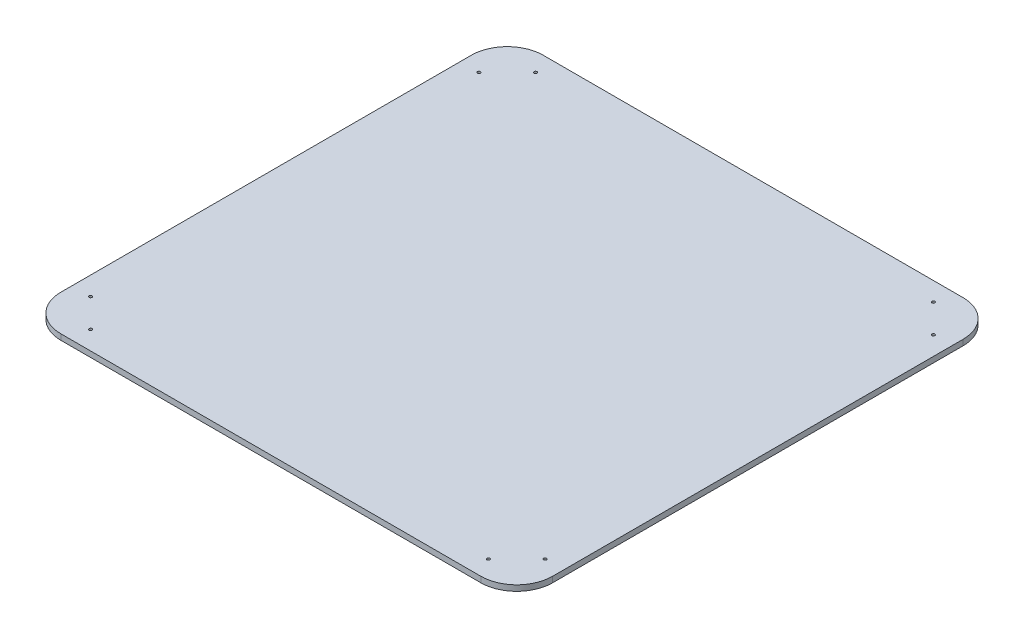
ISO-10303-21;
HEADER;
FILE_DESCRIPTION(('STEP AP214'),'2;1');
FILE_NAME('part.step','',(''),(''),'','','');
FILE_SCHEMA(('AUTOMOTIVE_DESIGN { 1 0 10303 214 1 1 1 1 }'));
ENDSEC;
DATA;
#1=APPLICATION_CONTEXT('core data for automotive mechanical design processes');
#2=APPLICATION_PROTOCOL_DEFINITION('international standard','automotive_design',2000,#1);
#3=PRODUCT_CONTEXT('',#1,'mechanical');
#4=PRODUCT('Part','Part','',(#3));
#5=PRODUCT_RELATED_PRODUCT_CATEGORY('part','',(#4));
#6=PRODUCT_DEFINITION_FORMATION('','',#4);
#7=PRODUCT_DEFINITION_CONTEXT('part definition',#1,'design');
#8=PRODUCT_DEFINITION('design','',#6,#7);
#9=PRODUCT_DEFINITION_SHAPE('','',#8);
#10=(LENGTH_UNIT() NAMED_UNIT(*) SI_UNIT(.MILLI.,.METRE.));
#11=(NAMED_UNIT(*) PLANE_ANGLE_UNIT() SI_UNIT($,.RADIAN.));
#12=(NAMED_UNIT(*) SI_UNIT($,.STERADIAN.) SOLID_ANGLE_UNIT());
#13=UNCERTAINTY_MEASURE_WITH_UNIT(LENGTH_MEASURE(1.E-05),#10,'distance_accuracy_value','');
#14=(GEOMETRIC_REPRESENTATION_CONTEXT(3) GLOBAL_UNCERTAINTY_ASSIGNED_CONTEXT((#13)) GLOBAL_UNIT_ASSIGNED_CONTEXT((#10,
#11,#12)) REPRESENTATION_CONTEXT('',''));
#15=CARTESIAN_POINT('',(0.,0.,0.));
#16=DIRECTION('',(0.,0.,1.));
#17=DIRECTION('',(1.,0.,0.));
#18=AXIS2_PLACEMENT_3D('',#15,#16,#17);
#19=CARTESIAN_POINT('',(0.,6.,0.));
#20=DIRECTION('',(1.,0.,0.));
#21=DIRECTION('',(0.,0.,-1.));
#22=AXIS2_PLACEMENT_3D('',#19,#20,#21);
#23=PLANE('',#22);
#24=DIRECTION('',(0.,0.,1.));
#25=VECTOR('',#24,1.);
#26=CARTESIAN_POINT('',(0.,0.,0.));
#27=LINE('',#26,#25);
#28=CARTESIAN_POINT('',(0.,0.,-472.));
#29=VERTEX_POINT('',#28);
#30=CARTESIAN_POINT('',(0.,0.,-38.));
#31=VERTEX_POINT('',#30);
#32=EDGE_CURVE('E174',#29,#31,#27,.T.);
#33=ORIENTED_EDGE('',*,*,#32,.T.);
#34=DIRECTION('',(0.,-1.,0.));
#35=VECTOR('',#34,1.);
#36=CARTESIAN_POINT('',(0.,6.,-38.));
#37=LINE('',#36,#35);
#38=CARTESIAN_POINT('',(0.,6.,-38.));
#39=VERTEX_POINT('',#38);
#40=EDGE_CURVE('E11',#31,#39,#37,.F.);
#41=ORIENTED_EDGE('',*,*,#40,.T.);
#42=DIRECTION('',(0.,0.,1.));
#43=VECTOR('',#42,1.);
#44=CARTESIAN_POINT('',(0.,6.,0.));
#45=LINE('',#44,#43);
#46=CARTESIAN_POINT('',(0.,6.,-472.));
#47=VERTEX_POINT('',#46);
#48=EDGE_CURVE('E138',#47,#39,#45,.T.);
#49=ORIENTED_EDGE('',*,*,#48,.F.);
#50=DIRECTION('',(0.,-1.,0.));
#51=VECTOR('',#50,1.);
#52=CARTESIAN_POINT('',(0.,6.,-472.));
#53=LINE('',#52,#51);
#54=EDGE_CURVE('E50',#47,#29,#53,.T.);
#55=ORIENTED_EDGE('',*,*,#54,.T.);
#56=EDGE_LOOP('',(#33,#41,#49,#55));
#57=FACE_BOUND('',#56,.T.);
#58=ADVANCED_FACE('F41',(#57),#23,.F.);
#59=CARTESIAN_POINT('',(0.,6.,0.));
#60=DIRECTION('',(0.,0.,-1.));
#61=DIRECTION('',(-1.,0.,0.));
#62=AXIS2_PLACEMENT_3D('',#59,#60,#61);
#63=PLANE('',#62);
#64=DIRECTION('',(1.,0.,0.));
#65=VECTOR('',#64,1.);
#66=CARTESIAN_POINT('',(0.,0.,0.));
#67=LINE('',#66,#65);
#68=CARTESIAN_POINT('',(38.,0.,0.));
#69=VERTEX_POINT('',#68);
#70=CARTESIAN_POINT('',(482.,0.,0.));
#71=VERTEX_POINT('',#70);
#72=EDGE_CURVE('E144',#69,#71,#67,.T.);
#73=ORIENTED_EDGE('',*,*,#72,.T.);
#74=DIRECTION('',(0.,-1.,0.));
#75=VECTOR('',#74,1.);
#76=CARTESIAN_POINT('',(482.,6.,0.));
#77=LINE('',#76,#75);
#78=CARTESIAN_POINT('',(482.,6.,0.));
#79=VERTEX_POINT('',#78);
#80=EDGE_CURVE('E57',#71,#79,#77,.F.);
#81=ORIENTED_EDGE('',*,*,#80,.T.);
#82=DIRECTION('',(1.,0.,0.));
#83=VECTOR('',#82,1.);
#84=CARTESIAN_POINT('',(0.,6.,0.));
#85=LINE('',#84,#83);
#86=CARTESIAN_POINT('',(38.,6.,0.));
#87=VERTEX_POINT('',#86);
#88=EDGE_CURVE('E142',#87,#79,#85,.T.);
#89=ORIENTED_EDGE('',*,*,#88,.F.);
#90=DIRECTION('',(0.,-1.,0.));
#91=VECTOR('',#90,1.);
#92=CARTESIAN_POINT('',(38.,6.,0.));
#93=LINE('',#92,#91);
#94=EDGE_CURVE('E165',#87,#69,#93,.T.);
#95=ORIENTED_EDGE('',*,*,#94,.T.);
#96=EDGE_LOOP('',(#73,#81,#89,#95));
#97=FACE_BOUND('',#96,.T.);
#98=ADVANCED_FACE('F262',(#97),#63,.F.);
#99=CARTESIAN_POINT('',(520.,6.,0.));
#100=DIRECTION('',(-1.,0.,0.));
#101=DIRECTION('',(0.,0.,1.));
#102=AXIS2_PLACEMENT_3D('',#99,#100,#101);
#103=PLANE('',#102);
#104=DIRECTION('',(0.,0.,-1.));
#105=VECTOR('',#104,1.);
#106=CARTESIAN_POINT('',(520.,0.,0.));
#107=LINE('',#106,#105);
#108=CARTESIAN_POINT('',(520.,0.,-38.));
#109=VERTEX_POINT('',#108);
#110=CARTESIAN_POINT('',(520.,0.,-472.));
#111=VERTEX_POINT('',#110);
#112=EDGE_CURVE('E139',#109,#111,#107,.T.);
#113=ORIENTED_EDGE('',*,*,#112,.T.);
#114=DIRECTION('',(0.,-1.,0.));
#115=VECTOR('',#114,1.);
#116=CARTESIAN_POINT('',(520.,6.,-472.));
#117=LINE('',#116,#115);
#118=CARTESIAN_POINT('',(520.,6.,-472.));
#119=VERTEX_POINT('',#118);
#120=EDGE_CURVE('E117',#111,#119,#117,.F.);
#121=ORIENTED_EDGE('',*,*,#120,.T.);
#122=DIRECTION('',(0.,0.,-1.));
#123=VECTOR('',#122,1.);
#124=CARTESIAN_POINT('',(520.,6.,0.));
#125=LINE('',#124,#123);
#126=CARTESIAN_POINT('',(520.,6.,-38.));
#127=VERTEX_POINT('',#126);
#128=EDGE_CURVE('E189',#127,#119,#125,.T.);
#129=ORIENTED_EDGE('',*,*,#128,.F.);
#130=DIRECTION('',(0.,-1.,0.));
#131=VECTOR('',#130,1.);
#132=CARTESIAN_POINT('',(520.,6.,-38.));
#133=LINE('',#132,#131);
#134=EDGE_CURVE('E122',#127,#109,#133,.T.);
#135=ORIENTED_EDGE('',*,*,#134,.T.);
#136=EDGE_LOOP('',(#113,#121,#129,#135));
#137=FACE_BOUND('',#136,.T.);
#138=ADVANCED_FACE('F259',(#137),#103,.F.);
#139=CARTESIAN_POINT('',(0.,6.,-510.));
#140=DIRECTION('',(0.,0.,1.));
#141=DIRECTION('',(1.,0.,0.));
#142=AXIS2_PLACEMENT_3D('',#139,#140,#141);
#143=PLANE('',#142);
#144=DIRECTION('',(-1.,0.,0.));
#145=VECTOR('',#144,1.);
#146=CARTESIAN_POINT('',(0.,6.,-510.));
#147=LINE('',#146,#145);
#148=CARTESIAN_POINT('',(482.,6.,-510.));
#149=VERTEX_POINT('',#148);
#150=CARTESIAN_POINT('',(38.,6.,-510.));
#151=VERTEX_POINT('',#150);
#152=EDGE_CURVE('E132',#149,#151,#147,.T.);
#153=ORIENTED_EDGE('',*,*,#152,.F.);
#154=DIRECTION('',(0.,-1.,0.));
#155=VECTOR('',#154,1.);
#156=CARTESIAN_POINT('',(482.,6.,-510.));
#157=LINE('',#156,#155);
#158=CARTESIAN_POINT('',(482.,0.,-510.));
#159=VERTEX_POINT('',#158);
#160=EDGE_CURVE('E116',#149,#159,#157,.T.);
#161=ORIENTED_EDGE('',*,*,#160,.T.);
#162=DIRECTION('',(-1.,0.,0.));
#163=VECTOR('',#162,1.);
#164=CARTESIAN_POINT('',(0.,0.,-510.));
#165=LINE('',#164,#163);
#166=CARTESIAN_POINT('',(38.,0.,-510.));
#167=VERTEX_POINT('',#166);
#168=EDGE_CURVE('E129',#159,#167,#165,.T.);
#169=ORIENTED_EDGE('',*,*,#168,.T.);
#170=DIRECTION('',(0.,-1.,0.));
#171=VECTOR('',#170,1.);
#172=CARTESIAN_POINT('',(38.,6.,-510.));
#173=LINE('',#172,#171);
#174=EDGE_CURVE('E134',#167,#151,#173,.F.);
#175=ORIENTED_EDGE('',*,*,#174,.T.);
#176=EDGE_LOOP('',(#153,#161,#169,#175));
#177=FACE_BOUND('',#176,.T.);
#178=ADVANCED_FACE('F128',(#177),#143,.F.);
#179=CARTESIAN_POINT('',(0.,6.,0.));
#180=DIRECTION('',(0.,-1.,0.));
#181=DIRECTION('',(0.,0.,-1.));
#182=AXIS2_PLACEMENT_3D('',#179,#180,#181);
#183=PLANE('',#182);
#184=CARTESIAN_POINT('',(500.25,6.,-49.7500000000001));
#185=DIRECTION('',(0.,1.,0.));
#186=DIRECTION('',(0.,0.,1.));
#187=AXIS2_PLACEMENT_3D('',#184,#185,#186);
#188=CIRCLE('',#187,1.54999999999999);
#189=CARTESIAN_POINT('',(500.25,6.,-48.2000000000001));
#190=VERTEX_POINT('',#189);
#191=EDGE_CURVE('E215',#190,#190,#188,.T.);
#192=ORIENTED_EDGE('',*,*,#191,.F.);
#193=EDGE_LOOP('',(#192));
#194=FACE_BOUND('',#193,.T.);
#195=CARTESIAN_POINT('',(470.25,6.,-490.25));
#196=DIRECTION('',(0.,1.,0.));
#197=DIRECTION('',(0.,0.,1.));
#198=AXIS2_PLACEMENT_3D('',#195,#196,#197);
#199=CIRCLE('',#198,1.55);
#200=CARTESIAN_POINT('',(470.25,6.,-488.7));
#201=VERTEX_POINT('',#200);
#202=EDGE_CURVE('E209',#201,#201,#199,.T.);
#203=ORIENTED_EDGE('',*,*,#202,.F.);
#204=EDGE_LOOP('',(#203));
#205=FACE_BOUND('',#204,.T.);
#206=CARTESIAN_POINT('',(19.75,6.,-460.25));
#207=DIRECTION('',(0.,1.,0.));
#208=DIRECTION('',(0.,0.,-1.));
#209=AXIS2_PLACEMENT_3D('',#206,#207,#208);
#210=CIRCLE('',#209,1.55000000000002);
#211=CARTESIAN_POINT('',(19.75,6.,-461.8));
#212=VERTEX_POINT('',#211);
#213=EDGE_CURVE('E200',#212,#212,#210,.T.);
#214=ORIENTED_EDGE('',*,*,#213,.F.);
#215=EDGE_LOOP('',(#214));
#216=FACE_BOUND('',#215,.T.);
#217=CARTESIAN_POINT('',(19.7500000000001,6.,-49.75));
#218=DIRECTION('',(0.,1.,0.));
#219=DIRECTION('',(0.,0.,-1.));
#220=AXIS2_PLACEMENT_3D('',#217,#218,#219);
#221=CIRCLE('',#220,1.54999999999999);
#222=CARTESIAN_POINT('',(19.7500000000001,6.,-51.3));
#223=VERTEX_POINT('',#222);
#224=EDGE_CURVE('E201',#223,#223,#221,.T.);
#225=ORIENTED_EDGE('',*,*,#224,.F.);
#226=EDGE_LOOP('',(#225));
#227=FACE_BOUND('',#226,.T.);
#228=CARTESIAN_POINT('',(49.75,6.,-19.7499999999999));
#229=DIRECTION('',(0.,1.,0.));
#230=DIRECTION('',(0.,0.,-1.));
#231=AXIS2_PLACEMENT_3D('',#228,#229,#230);
#232=CIRCLE('',#231,1.54999999999999);
#233=CARTESIAN_POINT('',(49.75,6.,-21.2999999999999));
#234=VERTEX_POINT('',#233);
#235=EDGE_CURVE('E237',#234,#234,#232,.T.);
#236=ORIENTED_EDGE('',*,*,#235,.F.);
#237=EDGE_LOOP('',(#236));
#238=FACE_BOUND('',#237,.T.);
#239=CARTESIAN_POINT('',(49.7500000000001,6.,-490.25));
#240=DIRECTION('',(0.,1.,0.));
#241=DIRECTION('',(0.,0.,-1.));
#242=AXIS2_PLACEMENT_3D('',#239,#240,#241);
#243=CIRCLE('',#242,1.55000000000001);
#244=CARTESIAN_POINT('',(49.7500000000001,6.,-491.8));
#245=VERTEX_POINT('',#244);
#246=EDGE_CURVE('E226',#245,#245,#243,.T.);
#247=ORIENTED_EDGE('',*,*,#246,.F.);
#248=EDGE_LOOP('',(#247));
#249=FACE_BOUND('',#248,.T.);
#250=CARTESIAN_POINT('',(470.25,6.,-19.7500000000001));
#251=DIRECTION('',(0.,1.,0.));
#252=DIRECTION('',(0.,0.,1.));
#253=AXIS2_PLACEMENT_3D('',#250,#251,#252);
#254=CIRCLE('',#253,1.54999999999999);
#255=CARTESIAN_POINT('',(470.25,6.,-18.2000000000001));
#256=VERTEX_POINT('',#255);
#257=EDGE_CURVE('E225',#256,#256,#254,.T.);
#258=ORIENTED_EDGE('',*,*,#257,.F.);
#259=EDGE_LOOP('',(#258));
#260=FACE_BOUND('',#259,.T.);
#261=CARTESIAN_POINT('',(500.25,6.,-460.25));
#262=DIRECTION('',(0.,1.,0.));
#263=DIRECTION('',(0.,0.,1.));
#264=AXIS2_PLACEMENT_3D('',#261,#262,#263);
#265=CIRCLE('',#264,1.55);
#266=CARTESIAN_POINT('',(500.25,6.,-458.7));
#267=VERTEX_POINT('',#266);
#268=EDGE_CURVE('E185',#267,#267,#265,.T.);
#269=ORIENTED_EDGE('',*,*,#268,.F.);
#270=EDGE_LOOP('',(#269));
#271=FACE_BOUND('',#270,.T.);
#272=ORIENTED_EDGE('',*,*,#128,.T.);
#273=CARTESIAN_POINT('',(482.,6.,-472.));
#274=DIRECTION('',(0.,-1.,0.));
#275=DIRECTION('',(0.,0.,-1.));
#276=AXIS2_PLACEMENT_3D('',#273,#274,#275);
#277=CIRCLE('',#276,38.);
#278=EDGE_CURVE('E163',#119,#149,#277,.F.);
#279=ORIENTED_EDGE('',*,*,#278,.T.);
#280=ORIENTED_EDGE('',*,*,#152,.T.);
#281=CARTESIAN_POINT('',(38.,6.,-472.));
#282=DIRECTION('',(0.,-1.,0.));
#283=DIRECTION('',(0.,0.,-1.));
#284=AXIS2_PLACEMENT_3D('',#281,#282,#283);
#285=CIRCLE('',#284,38.);
#286=EDGE_CURVE('E157',#151,#47,#285,.F.);
#287=ORIENTED_EDGE('',*,*,#286,.T.);
#288=ORIENTED_EDGE('',*,*,#48,.T.);
#289=CARTESIAN_POINT('',(38.,6.,-38.));
#290=DIRECTION('',(0.,-1.,0.));
#291=DIRECTION('',(0.,0.,-1.));
#292=AXIS2_PLACEMENT_3D('',#289,#290,#291);
#293=CIRCLE('',#292,38.);
#294=EDGE_CURVE('E67',#39,#87,#293,.F.);
#295=ORIENTED_EDGE('',*,*,#294,.T.);
#296=ORIENTED_EDGE('',*,*,#88,.T.);
#297=CARTESIAN_POINT('',(482.,6.,-38.));
#298=DIRECTION('',(0.,-1.,0.));
#299=DIRECTION('',(0.,0.,-1.));
#300=AXIS2_PLACEMENT_3D('',#297,#298,#299);
#301=CIRCLE('',#300,38.);
#302=EDGE_CURVE('E161',#79,#127,#301,.F.);
#303=ORIENTED_EDGE('',*,*,#302,.T.);
#304=EDGE_LOOP('',(#272,#279,#280,#287,#288,#295,#296,#303));
#305=FACE_BOUND('',#304,.T.);
#306=ADVANCED_FACE('F245',(#194,#205,#216,#227,#238,#249,#260,#271,#305),#183,.F.);
#307=CARTESIAN_POINT('',(0.,0.,0.));
#308=DIRECTION('',(0.,-1.,0.));
#309=DIRECTION('',(0.,0.,-1.));
#310=AXIS2_PLACEMENT_3D('',#307,#308,#309);
#311=PLANE('',#310);
#312=CARTESIAN_POINT('',(500.25,0.,-49.7500000000001));
#313=DIRECTION('',(0.,-1.,0.));
#314=DIRECTION('',(0.,0.,-1.));
#315=AXIS2_PLACEMENT_3D('',#312,#313,#314);
#316=CIRCLE('',#315,1.54999999999999);
#317=CARTESIAN_POINT('',(500.25,0.,-51.3));
#318=VERTEX_POINT('',#317);
#319=EDGE_CURVE('E195',#318,#318,#316,.F.);
#320=ORIENTED_EDGE('',*,*,#319,.T.);
#321=EDGE_LOOP('',(#320));
#322=FACE_BOUND('',#321,.T.);
#323=CARTESIAN_POINT('',(470.25,0.,-490.25));
#324=DIRECTION('',(0.,-1.,0.));
#325=DIRECTION('',(0.,0.,-1.));
#326=AXIS2_PLACEMENT_3D('',#323,#324,#325);
#327=CIRCLE('',#326,1.55);
#328=CARTESIAN_POINT('',(470.25,0.,-491.8));
#329=VERTEX_POINT('',#328);
#330=EDGE_CURVE('E212',#329,#329,#327,.F.);
#331=ORIENTED_EDGE('',*,*,#330,.T.);
#332=EDGE_LOOP('',(#331));
#333=FACE_BOUND('',#332,.T.);
#334=CARTESIAN_POINT('',(19.75,0.,-460.25));
#335=DIRECTION('',(0.,-1.,0.));
#336=DIRECTION('',(0.,0.,-1.));
#337=AXIS2_PLACEMENT_3D('',#334,#335,#336);
#338=CIRCLE('',#337,1.55000000000002);
#339=CARTESIAN_POINT('',(19.75,0.,-461.8));
#340=VERTEX_POINT('',#339);
#341=EDGE_CURVE('E206',#340,#340,#338,.F.);
#342=ORIENTED_EDGE('',*,*,#341,.T.);
#343=EDGE_LOOP('',(#342));
#344=FACE_BOUND('',#343,.T.);
#345=CARTESIAN_POINT('',(19.7500000000001,0.,-49.75));
#346=DIRECTION('',(0.,-1.,0.));
#347=DIRECTION('',(0.,0.,-1.));
#348=AXIS2_PLACEMENT_3D('',#345,#346,#347);
#349=CIRCLE('',#348,1.54999999999999);
#350=CARTESIAN_POINT('',(19.7500000000001,0.,-51.3));
#351=VERTEX_POINT('',#350);
#352=EDGE_CURVE('E196',#351,#351,#349,.F.);
#353=ORIENTED_EDGE('',*,*,#352,.T.);
#354=EDGE_LOOP('',(#353));
#355=FACE_BOUND('',#354,.T.);
#356=CARTESIAN_POINT('',(49.75,0.,-19.7499999999999));
#357=DIRECTION('',(0.,-1.,0.));
#358=DIRECTION('',(0.,0.,-1.));
#359=AXIS2_PLACEMENT_3D('',#356,#357,#358);
#360=CIRCLE('',#359,1.54999999999999);
#361=CARTESIAN_POINT('',(49.75,0.,-21.2999999999999));
#362=VERTEX_POINT('',#361);
#363=EDGE_CURVE('E229',#362,#362,#360,.F.);
#364=ORIENTED_EDGE('',*,*,#363,.T.);
#365=EDGE_LOOP('',(#364));
#366=FACE_BOUND('',#365,.T.);
#367=CARTESIAN_POINT('',(49.7500000000001,0.,-490.25));
#368=DIRECTION('',(0.,-1.,0.));
#369=DIRECTION('',(0.,0.,-1.));
#370=AXIS2_PLACEMENT_3D('',#367,#368,#369);
#371=CIRCLE('',#370,1.55000000000001);
#372=CARTESIAN_POINT('',(49.7500000000001,0.,-491.8));
#373=VERTEX_POINT('',#372);
#374=EDGE_CURVE('E222',#373,#373,#371,.F.);
#375=ORIENTED_EDGE('',*,*,#374,.T.);
#376=EDGE_LOOP('',(#375));
#377=FACE_BOUND('',#376,.T.);
#378=CARTESIAN_POINT('',(470.25,0.,-19.7500000000001));
#379=DIRECTION('',(0.,-1.,0.));
#380=DIRECTION('',(0.,0.,-1.));
#381=AXIS2_PLACEMENT_3D('',#378,#379,#380);
#382=CIRCLE('',#381,1.54999999999999);
#383=CARTESIAN_POINT('',(470.25,0.,-21.3000000000001));
#384=VERTEX_POINT('',#383);
#385=EDGE_CURVE('E205',#384,#384,#382,.F.);
#386=ORIENTED_EDGE('',*,*,#385,.T.);
#387=EDGE_LOOP('',(#386));
#388=FACE_BOUND('',#387,.T.);
#389=CARTESIAN_POINT('',(500.25,0.,-460.25));
#390=DIRECTION('',(0.,-1.,0.));
#391=DIRECTION('',(0.,0.,-1.));
#392=AXIS2_PLACEMENT_3D('',#389,#390,#391);
#393=CIRCLE('',#392,1.55);
#394=CARTESIAN_POINT('',(500.25,0.,-461.8));
#395=VERTEX_POINT('',#394);
#396=EDGE_CURVE('E180',#395,#395,#393,.F.);
#397=ORIENTED_EDGE('',*,*,#396,.T.);
#398=EDGE_LOOP('',(#397));
#399=FACE_BOUND('',#398,.T.);
#400=ORIENTED_EDGE('',*,*,#168,.F.);
#401=CARTESIAN_POINT('',(482.,0.,-472.));
#402=DIRECTION('',(0.,-1.,0.));
#403=DIRECTION('',(0.,0.,-1.));
#404=AXIS2_PLACEMENT_3D('',#401,#402,#403);
#405=CIRCLE('',#404,38.);
#406=EDGE_CURVE('E112',#159,#111,#405,.T.);
#407=ORIENTED_EDGE('',*,*,#406,.T.);
#408=ORIENTED_EDGE('',*,*,#112,.F.);
#409=CARTESIAN_POINT('',(482.,0.,-38.));
#410=DIRECTION('',(0.,-1.,0.));
#411=DIRECTION('',(0.,0.,-1.));
#412=AXIS2_PLACEMENT_3D('',#409,#410,#411);
#413=CIRCLE('',#412,38.);
#414=EDGE_CURVE('E123',#109,#71,#413,.T.);
#415=ORIENTED_EDGE('',*,*,#414,.T.);
#416=ORIENTED_EDGE('',*,*,#72,.F.);
#417=CARTESIAN_POINT('',(38.,0.,-38.));
#418=DIRECTION('',(0.,-1.,0.));
#419=DIRECTION('',(0.,0.,-1.));
#420=AXIS2_PLACEMENT_3D('',#417,#418,#419);
#421=CIRCLE('',#420,38.);
#422=EDGE_CURVE('E150',#69,#31,#421,.T.);
#423=ORIENTED_EDGE('',*,*,#422,.T.);
#424=ORIENTED_EDGE('',*,*,#32,.F.);
#425=CARTESIAN_POINT('',(38.,0.,-472.));
#426=DIRECTION('',(0.,-1.,0.));
#427=DIRECTION('',(0.,0.,-1.));
#428=AXIS2_PLACEMENT_3D('',#425,#426,#427);
#429=CIRCLE('',#428,38.);
#430=EDGE_CURVE('E133',#29,#167,#429,.T.);
#431=ORIENTED_EDGE('',*,*,#430,.T.);
#432=EDGE_LOOP('',(#400,#407,#408,#415,#416,#423,#424,#431));
#433=FACE_BOUND('',#432,.T.);
#434=ADVANCED_FACE('F136',(#322,#333,#344,#355,#366,#377,#388,#399,#433),#311,.T.);
#435=CARTESIAN_POINT('',(500.25,-4.38406204335662,-460.25));
#436=DIRECTION('',(0.,1.,0.));
#437=DIRECTION('',(0.,0.,1.));
#438=AXIS2_PLACEMENT_3D('',#435,#436,#437);
#439=CYLINDRICAL_SURFACE('',#438,1.55);
#440=ORIENTED_EDGE('',*,*,#268,.T.);
#441=EDGE_LOOP('',(#440));
#442=FACE_BOUND('',#441,.T.);
#443=ORIENTED_EDGE('',*,*,#396,.F.);
#444=EDGE_LOOP('',(#443));
#445=FACE_BOUND('',#444,.T.);
#446=ADVANCED_FACE('F363',(#442,#445),#439,.F.);
#447=CARTESIAN_POINT('',(470.25,-4.38406204335662,-19.7500000000001));
#448=DIRECTION('',(0.,1.,0.));
#449=DIRECTION('',(0.,0.,1.));
#450=AXIS2_PLACEMENT_3D('',#447,#448,#449);
#451=CYLINDRICAL_SURFACE('',#450,1.54999999999999);
#452=ORIENTED_EDGE('',*,*,#257,.T.);
#453=EDGE_LOOP('',(#452));
#454=FACE_BOUND('',#453,.T.);
#455=ORIENTED_EDGE('',*,*,#385,.F.);
#456=EDGE_LOOP('',(#455));
#457=FACE_BOUND('',#456,.T.);
#458=ADVANCED_FACE('F354',(#454,#457),#451,.F.);
#459=CARTESIAN_POINT('',(49.7500000000001,-4.38406204335662,-490.25));
#460=DIRECTION('',(0.,1.,0.));
#461=DIRECTION('',(0.,0.,1.));
#462=AXIS2_PLACEMENT_3D('',#459,#460,#461);
#463=CYLINDRICAL_SURFACE('',#462,1.55000000000001);
#464=ORIENTED_EDGE('',*,*,#246,.T.);
#465=EDGE_LOOP('',(#464));
#466=FACE_BOUND('',#465,.T.);
#467=ORIENTED_EDGE('',*,*,#374,.F.);
#468=EDGE_LOOP('',(#467));
#469=FACE_BOUND('',#468,.T.);
#470=ADVANCED_FACE('F346',(#466,#469),#463,.F.);
#471=CARTESIAN_POINT('',(49.75,-4.38406204335662,-19.7499999999999));
#472=DIRECTION('',(0.,1.,0.));
#473=DIRECTION('',(0.,0.,1.));
#474=AXIS2_PLACEMENT_3D('',#471,#472,#473);
#475=CYLINDRICAL_SURFACE('',#474,1.54999999999999);
#476=ORIENTED_EDGE('',*,*,#235,.T.);
#477=EDGE_LOOP('',(#476));
#478=FACE_BOUND('',#477,.T.);
#479=ORIENTED_EDGE('',*,*,#363,.F.);
#480=EDGE_LOOP('',(#479));
#481=FACE_BOUND('',#480,.T.);
#482=ADVANCED_FACE('F242',(#478,#481),#475,.F.);
#483=CARTESIAN_POINT('',(19.7500000000001,-4.38406204335662,-49.75));
#484=DIRECTION('',(0.,1.,0.));
#485=DIRECTION('',(0.,0.,1.));
#486=AXIS2_PLACEMENT_3D('',#483,#484,#485);
#487=CYLINDRICAL_SURFACE('',#486,1.54999999999999);
#488=ORIENTED_EDGE('',*,*,#224,.T.);
#489=EDGE_LOOP('',(#488));
#490=FACE_BOUND('',#489,.T.);
#491=ORIENTED_EDGE('',*,*,#352,.F.);
#492=EDGE_LOOP('',(#491));
#493=FACE_BOUND('',#492,.T.);
#494=ADVANCED_FACE('F329',(#490,#493),#487,.F.);
#495=CARTESIAN_POINT('',(19.75,-4.38406204335662,-460.25));
#496=DIRECTION('',(0.,1.,0.));
#497=DIRECTION('',(0.,0.,1.));
#498=AXIS2_PLACEMENT_3D('',#495,#496,#497);
#499=CYLINDRICAL_SURFACE('',#498,1.55000000000002);
#500=ORIENTED_EDGE('',*,*,#213,.T.);
#501=EDGE_LOOP('',(#500));
#502=FACE_BOUND('',#501,.T.);
#503=ORIENTED_EDGE('',*,*,#341,.F.);
#504=EDGE_LOOP('',(#503));
#505=FACE_BOUND('',#504,.T.);
#506=ADVANCED_FACE('F320',(#502,#505),#499,.F.);
#507=CARTESIAN_POINT('',(470.25,-4.38406204335662,-490.25));
#508=DIRECTION('',(0.,1.,0.));
#509=DIRECTION('',(0.,0.,1.));
#510=AXIS2_PLACEMENT_3D('',#507,#508,#509);
#511=CYLINDRICAL_SURFACE('',#510,1.55);
#512=ORIENTED_EDGE('',*,*,#202,.T.);
#513=EDGE_LOOP('',(#512));
#514=FACE_BOUND('',#513,.T.);
#515=ORIENTED_EDGE('',*,*,#330,.F.);
#516=EDGE_LOOP('',(#515));
#517=FACE_BOUND('',#516,.T.);
#518=ADVANCED_FACE('F311',(#514,#517),#511,.F.);
#519=CARTESIAN_POINT('',(500.25,-4.38406204335662,-49.7500000000001));
#520=DIRECTION('',(0.,1.,0.));
#521=DIRECTION('',(0.,0.,1.));
#522=AXIS2_PLACEMENT_3D('',#519,#520,#521);
#523=CYLINDRICAL_SURFACE('',#522,1.54999999999999);
#524=ORIENTED_EDGE('',*,*,#191,.T.);
#525=EDGE_LOOP('',(#524));
#526=FACE_BOUND('',#525,.T.);
#527=ORIENTED_EDGE('',*,*,#319,.F.);
#528=EDGE_LOOP('',(#527));
#529=FACE_BOUND('',#528,.T.);
#530=ADVANCED_FACE('F280',(#526,#529),#523,.F.);
#531=CARTESIAN_POINT('',(482.,6.,-472.));
#532=DIRECTION('',(0.,-1.,0.));
#533=DIRECTION('',(0.,0.,-1.));
#534=AXIS2_PLACEMENT_3D('',#531,#532,#533);
#535=CYLINDRICAL_SURFACE('',#534,38.);
#536=ORIENTED_EDGE('',*,*,#278,.F.);
#537=ORIENTED_EDGE('',*,*,#120,.F.);
#538=ORIENTED_EDGE('',*,*,#406,.F.);
#539=ORIENTED_EDGE('',*,*,#160,.F.);
#540=EDGE_LOOP('',(#536,#537,#538,#539));
#541=FACE_BOUND('',#540,.T.);
#542=ADVANCED_FACE('F115',(#541),#535,.T.);
#543=CARTESIAN_POINT('',(482.,6.,-38.));
#544=DIRECTION('',(0.,-1.,0.));
#545=DIRECTION('',(0.,0.,-1.));
#546=AXIS2_PLACEMENT_3D('',#543,#544,#545);
#547=CYLINDRICAL_SURFACE('',#546,38.);
#548=ORIENTED_EDGE('',*,*,#302,.F.);
#549=ORIENTED_EDGE('',*,*,#80,.F.);
#550=ORIENTED_EDGE('',*,*,#414,.F.);
#551=ORIENTED_EDGE('',*,*,#134,.F.);
#552=EDGE_LOOP('',(#548,#549,#550,#551));
#553=FACE_BOUND('',#552,.T.);
#554=ADVANCED_FACE('F261',(#553),#547,.T.);
#555=CARTESIAN_POINT('',(38.,6.,-38.));
#556=DIRECTION('',(0.,-1.,0.));
#557=DIRECTION('',(0.,0.,-1.));
#558=AXIS2_PLACEMENT_3D('',#555,#556,#557);
#559=CYLINDRICAL_SURFACE('',#558,38.);
#560=ORIENTED_EDGE('',*,*,#294,.F.);
#561=ORIENTED_EDGE('',*,*,#40,.F.);
#562=ORIENTED_EDGE('',*,*,#422,.F.);
#563=ORIENTED_EDGE('',*,*,#94,.F.);
#564=EDGE_LOOP('',(#560,#561,#562,#563));
#565=FACE_BOUND('',#564,.T.);
#566=ADVANCED_FACE('F265',(#565),#559,.T.);
#567=CARTESIAN_POINT('',(38.,6.,-472.));
#568=DIRECTION('',(0.,-1.,0.));
#569=DIRECTION('',(0.,0.,-1.));
#570=AXIS2_PLACEMENT_3D('',#567,#568,#569);
#571=CYLINDRICAL_SURFACE('',#570,38.);
#572=ORIENTED_EDGE('',*,*,#286,.F.);
#573=ORIENTED_EDGE('',*,*,#174,.F.);
#574=ORIENTED_EDGE('',*,*,#430,.F.);
#575=ORIENTED_EDGE('',*,*,#54,.F.);
#576=EDGE_LOOP('',(#572,#573,#574,#575));
#577=FACE_BOUND('',#576,.T.);
#578=ADVANCED_FACE('F43',(#577),#571,.T.);
#579=CLOSED_SHELL('',(#58,#98,#138,#178,#306,#434,#446,#458,#470,#482,#494,#506,#518,#530,#542,
#554,#566,#578));
#580=MANIFOLD_SOLID_BREP('B2',#579);
#581=ADVANCED_BREP_SHAPE_REPRESENTATION('',(#18,#580),#14);
#582=SHAPE_DEFINITION_REPRESENTATION(#9,#581);
ENDSEC;
END-ISO-10303-21;
